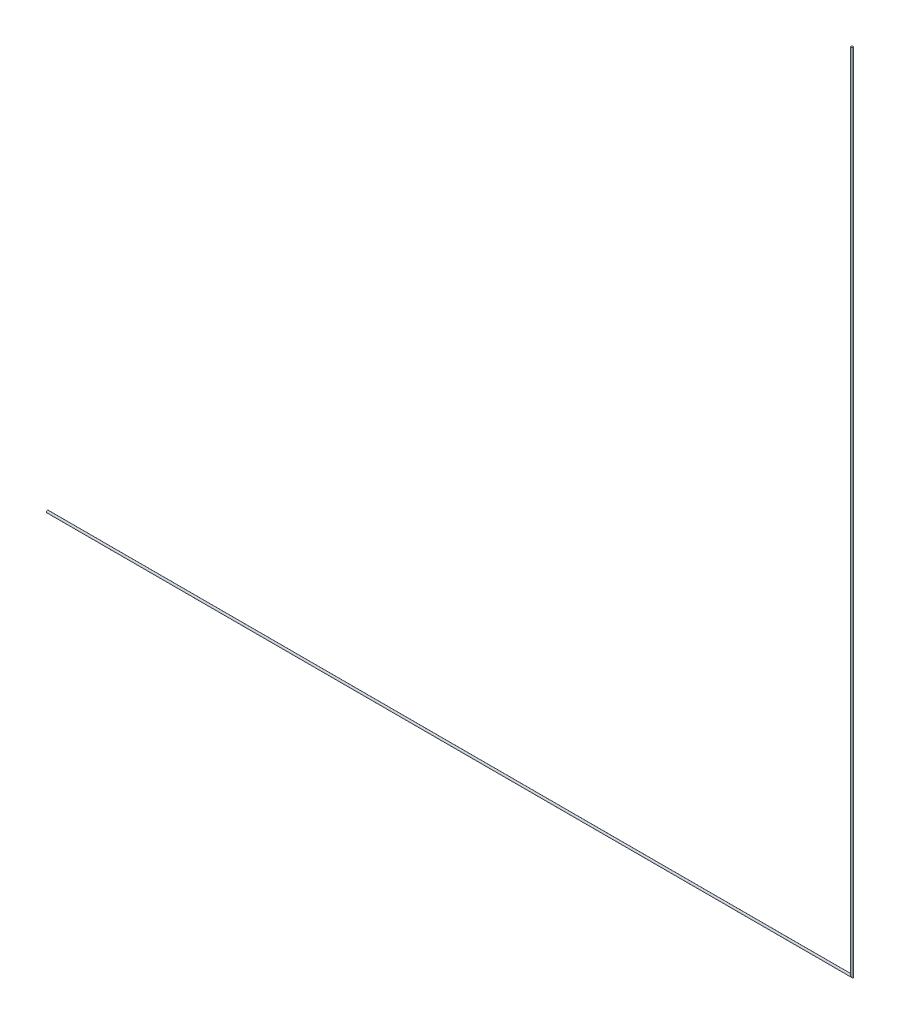
ISO-10303-21;
HEADER;
FILE_DESCRIPTION(('STEP AP214'),'2;1');
FILE_NAME('part.step','',(''),(''),'','','');
FILE_SCHEMA(('AUTOMOTIVE_DESIGN { 1 0 10303 214 1 1 1 1 }'));
ENDSEC;
DATA;
#1=APPLICATION_CONTEXT('core data for automotive mechanical design processes');
#2=APPLICATION_PROTOCOL_DEFINITION('international standard','automotive_design',2000,#1);
#3=PRODUCT_CONTEXT('',#1,'mechanical');
#4=PRODUCT('Part','Part','',(#3));
#5=PRODUCT_RELATED_PRODUCT_CATEGORY('part','',(#4));
#6=PRODUCT_DEFINITION_FORMATION('','',#4);
#7=PRODUCT_DEFINITION_CONTEXT('part definition',#1,'design');
#8=PRODUCT_DEFINITION('design','',#6,#7);
#9=PRODUCT_DEFINITION_SHAPE('','',#8);
#10=(LENGTH_UNIT() NAMED_UNIT(*) SI_UNIT(.MILLI.,.METRE.));
#11=(NAMED_UNIT(*) PLANE_ANGLE_UNIT() SI_UNIT($,.RADIAN.));
#12=(NAMED_UNIT(*) SI_UNIT($,.STERADIAN.) SOLID_ANGLE_UNIT());
#13=UNCERTAINTY_MEASURE_WITH_UNIT(LENGTH_MEASURE(1.E-05),#10,'distance_accuracy_value','');
#14=(GEOMETRIC_REPRESENTATION_CONTEXT(3) GLOBAL_UNCERTAINTY_ASSIGNED_CONTEXT((#13)) GLOBAL_UNIT_ASSIGNED_CONTEXT((#10,
#11,#12)) REPRESENTATION_CONTEXT('',''));
#15=CARTESIAN_POINT('',(0.,0.,0.));
#16=DIRECTION('',(0.,0.,1.));
#17=DIRECTION('',(1.,0.,0.));
#18=AXIS2_PLACEMENT_3D('',#15,#16,#17);
#19=CARTESIAN_POINT('',(0.,0.,0.));
#20=DIRECTION('',(1.,0.,0.));
#21=DIRECTION('',(0.,0.,-1.));
#22=AXIS2_PLACEMENT_3D('',#19,#20,#21);
#23=PLANE('',#22);
#24=CARTESIAN_POINT('',(0.,0.,0.));
#25=DIRECTION('',(1.,0.,0.));
#26=DIRECTION('',(0.,0.,-1.));
#27=AXIS2_PLACEMENT_3D('',#24,#25,#26);
#28=CIRCLE('',#27,1.);
#29=CARTESIAN_POINT('',(0.,0.,-1.));
#30=VERTEX_POINT('',#29);
#31=EDGE_CURVE('E34',#30,#30,#28,.T.);
#32=ORIENTED_EDGE('',*,*,#31,.F.);
#33=EDGE_LOOP('',(#32));
#34=FACE_BOUND('',#33,.T.);
#35=ADVANCED_FACE('F31',(#34),#23,.F.);
#36=CARTESIAN_POINT('',(762.,762.,0.));
#37=DIRECTION('',(0.,1.,0.));
#38=DIRECTION('',(0.,0.,-1.));
#39=AXIS2_PLACEMENT_3D('',#36,#37,#38);
#40=PLANE('',#39);
#41=CARTESIAN_POINT('',(762.,762.,0.));
#42=DIRECTION('',(0.,1.,0.));
#43=DIRECTION('',(0.,0.,-1.));
#44=AXIS2_PLACEMENT_3D('',#41,#42,#43);
#45=CIRCLE('',#44,1.);
#46=CARTESIAN_POINT('',(762.,762.,-1.));
#47=VERTEX_POINT('',#46);
#48=EDGE_CURVE('E38',#47,#47,#45,.T.);
#49=ORIENTED_EDGE('',*,*,#48,.T.);
#50=EDGE_LOOP('',(#49));
#51=FACE_BOUND('',#50,.T.);
#52=ADVANCED_FACE('F51',(#51),#40,.T.);
#53=CARTESIAN_POINT('',(764.3,0.,0.));
#54=DIRECTION('',(-1.,0.,0.));
#55=DIRECTION('',(0.,0.,1.));
#56=AXIS2_PLACEMENT_3D('',#53,#54,#55);
#57=CYLINDRICAL_SURFACE('',#56,1.);
#58=CARTESIAN_POINT('',(762.,2.22044604925031E-13,0.));
#59=DIRECTION('',(-0.707106781186548,-0.707106781186548,0.));
#60=DIRECTION('',(0.707106781186548,-0.707106781186548,0.));
#61=AXIS2_PLACEMENT_3D('',#58,#59,#60);
#62=ELLIPSE('',#61,1.41421356237309,1.);
#63=CARTESIAN_POINT('',(763.,-0.999999999999778,0.));
#64=VERTEX_POINT('',#63);
#65=EDGE_CURVE('E10',#64,#64,#62,.T.);
#66=ORIENTED_EDGE('',*,*,#65,.T.);
#67=EDGE_LOOP('',(#66));
#68=FACE_BOUND('',#67,.T.);
#69=ORIENTED_EDGE('',*,*,#31,.T.);
#70=EDGE_LOOP('',(#69));
#71=FACE_BOUND('',#70,.T.);
#72=ADVANCED_FACE('F48',(#68,#71),#57,.T.);
#73=CARTESIAN_POINT('',(762.,762.,0.));
#74=DIRECTION('',(0.,-1.,0.));
#75=DIRECTION('',(0.,0.,-1.));
#76=AXIS2_PLACEMENT_3D('',#73,#74,#75);
#77=CYLINDRICAL_SURFACE('',#76,1.);
#78=ORIENTED_EDGE('',*,*,#48,.F.);
#79=EDGE_LOOP('',(#78));
#80=FACE_BOUND('',#79,.T.);
#81=ORIENTED_EDGE('',*,*,#65,.F.);
#82=EDGE_LOOP('',(#81));
#83=FACE_BOUND('',#82,.T.);
#84=ADVANCED_FACE('F55',(#80,#83),#77,.T.);
#85=CLOSED_SHELL('',(#35,#52,#72,#84));
#86=MANIFOLD_SOLID_BREP('B2',#85);
#87=ADVANCED_BREP_SHAPE_REPRESENTATION('',(#18,#86),#14);
#88=SHAPE_DEFINITION_REPRESENTATION(#9,#87);
ENDSEC;
END-ISO-10303-21;
